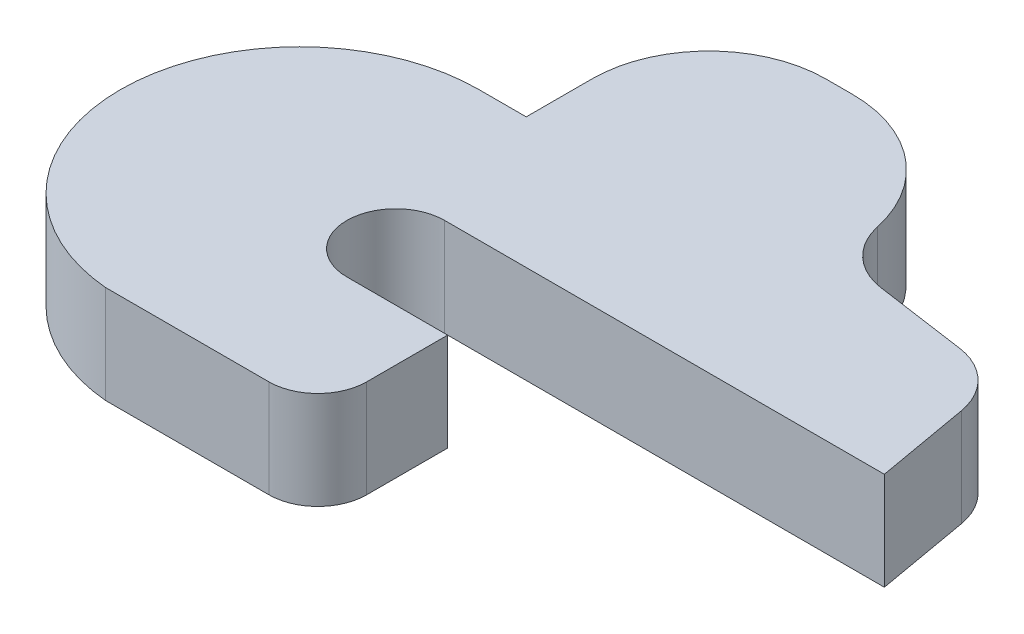
ISO-10303-21;
HEADER;
FILE_DESCRIPTION(('STEP AP214'),'2;1');
FILE_NAME('part.step','',(''),(''),'','','');
FILE_SCHEMA(('AUTOMOTIVE_DESIGN { 1 0 10303 214 1 1 1 1 }'));
ENDSEC;
DATA;
#1=APPLICATION_CONTEXT('core data for automotive mechanical design processes');
#2=APPLICATION_PROTOCOL_DEFINITION('international standard','automotive_design',2000,#1);
#3=PRODUCT_CONTEXT('',#1,'mechanical');
#4=PRODUCT('Part','Part','',(#3));
#5=PRODUCT_RELATED_PRODUCT_CATEGORY('part','',(#4));
#6=PRODUCT_DEFINITION_FORMATION('','',#4);
#7=PRODUCT_DEFINITION_CONTEXT('part definition',#1,'design');
#8=PRODUCT_DEFINITION('design','',#6,#7);
#9=PRODUCT_DEFINITION_SHAPE('','',#8);
#10=(LENGTH_UNIT() NAMED_UNIT(*) SI_UNIT(.MILLI.,.METRE.));
#11=(NAMED_UNIT(*) PLANE_ANGLE_UNIT() SI_UNIT($,.RADIAN.));
#12=(NAMED_UNIT(*) SI_UNIT($,.STERADIAN.) SOLID_ANGLE_UNIT());
#13=UNCERTAINTY_MEASURE_WITH_UNIT(LENGTH_MEASURE(1.E-05),#10,'distance_accuracy_value','');
#14=(GEOMETRIC_REPRESENTATION_CONTEXT(3) GLOBAL_UNCERTAINTY_ASSIGNED_CONTEXT((#13)) GLOBAL_UNIT_ASSIGNED_CONTEXT((#10,
#11,#12)) REPRESENTATION_CONTEXT('',''));
#15=CARTESIAN_POINT('',(0.,0.,0.));
#16=DIRECTION('',(0.,0.,1.));
#17=DIRECTION('',(1.,0.,0.));
#18=AXIS2_PLACEMENT_3D('',#15,#16,#17);
#19=CARTESIAN_POINT('',(0.,3.,2.48));
#20=DIRECTION('',(-1.,0.,0.));
#21=DIRECTION('',(0.,0.,1.));
#22=AXIS2_PLACEMENT_3D('',#19,#20,#21);
#23=PLANE('',#22);
#24=DIRECTION('',(0.,0.,-1.));
#25=VECTOR('',#24,1.);
#26=CARTESIAN_POINT('',(0.,0.,2.48));
#27=LINE('',#26,#25);
#28=CARTESIAN_POINT('',(0.,0.,2.48));
#29=VERTEX_POINT('',#28);
#30=CARTESIAN_POINT('',(0.,0.,0.));
#31=VERTEX_POINT('',#30);
#32=EDGE_CURVE('E177',#29,#31,#27,.T.);
#33=ORIENTED_EDGE('',*,*,#32,.T.);
#34=DIRECTION('',(0.,-1.,0.));
#35=VECTOR('',#34,1.);
#36=CARTESIAN_POINT('',(0.,3.,0.));
#37=LINE('',#36,#35);
#38=CARTESIAN_POINT('',(0.,3.,0.));
#39=VERTEX_POINT('',#38);
#40=EDGE_CURVE('E11',#39,#31,#37,.T.);
#41=ORIENTED_EDGE('',*,*,#40,.F.);
#42=DIRECTION('',(0.,0.,-1.));
#43=VECTOR('',#42,1.);
#44=CARTESIAN_POINT('',(0.,3.,2.48));
#45=LINE('',#44,#43);
#46=CARTESIAN_POINT('',(0.,3.,2.48));
#47=VERTEX_POINT('',#46);
#48=EDGE_CURVE('E207',#47,#39,#45,.T.);
#49=ORIENTED_EDGE('',*,*,#48,.F.);
#50=DIRECTION('',(0.,-1.,0.));
#51=VECTOR('',#50,1.);
#52=CARTESIAN_POINT('',(0.,3.,2.48));
#53=LINE('',#52,#51);
#54=EDGE_CURVE('E173',#47,#29,#53,.T.);
#55=ORIENTED_EDGE('',*,*,#54,.T.);
#56=EDGE_LOOP('',(#33,#41,#49,#55));
#57=FACE_BOUND('',#56,.T.);
#58=ADVANCED_FACE('F33',(#57),#23,.F.);
#59=CARTESIAN_POINT('',(0.,3.,0.));
#60=DIRECTION('',(0.,0.,1.));
#61=DIRECTION('',(1.,0.,0.));
#62=AXIS2_PLACEMENT_3D('',#59,#60,#61);
#63=PLANE('',#62);
#64=DIRECTION('',(-1.,0.,0.));
#65=VECTOR('',#64,1.);
#66=CARTESIAN_POINT('',(0.,0.,0.));
#67=LINE('',#66,#65);
#68=CARTESIAN_POINT('',(-3.09,0.,0.));
#69=VERTEX_POINT('',#68);
#70=EDGE_CURVE('E180',#31,#69,#67,.T.);
#71=ORIENTED_EDGE('',*,*,#70,.T.);
#72=DIRECTION('',(0.,-1.,0.));
#73=VECTOR('',#72,1.);
#74=CARTESIAN_POINT('',(-3.09,3.,0.));
#75=LINE('',#74,#73);
#76=CARTESIAN_POINT('',(-3.09,3.,0.));
#77=VERTEX_POINT('',#76);
#78=EDGE_CURVE('E41',#77,#69,#75,.T.);
#79=ORIENTED_EDGE('',*,*,#78,.F.);
#80=DIRECTION('',(-1.,0.,0.));
#81=VECTOR('',#80,1.);
#82=CARTESIAN_POINT('',(0.,3.,0.));
#83=LINE('',#82,#81);
#84=EDGE_CURVE('E116',#39,#77,#83,.T.);
#85=ORIENTED_EDGE('',*,*,#84,.F.);
#86=ORIENTED_EDGE('',*,*,#40,.T.);
#87=EDGE_LOOP('',(#71,#79,#85,#86));
#88=FACE_BOUND('',#87,.T.);
#89=ADVANCED_FACE('F305',(#88),#63,.F.);
#90=CARTESIAN_POINT('',(-3.09,3.,-1.5));
#91=DIRECTION('',(0.,-1.,0.));
#92=DIRECTION('',(0.,0.,-1.));
#93=AXIS2_PLACEMENT_3D('',#90,#91,#92);
#94=CYLINDRICAL_SURFACE('',#93,1.5);
#95=CARTESIAN_POINT('',(-3.09,0.,-1.5));
#96=DIRECTION('',(0.,-1.,0.));
#97=DIRECTION('',(0.,0.,-1.));
#98=AXIS2_PLACEMENT_3D('',#95,#96,#97);
#99=CIRCLE('',#98,1.5);
#100=CARTESIAN_POINT('',(-3.09,0.,-3.));
#101=VERTEX_POINT('',#100);
#102=EDGE_CURVE('E182',#69,#101,#99,.T.);
#103=ORIENTED_EDGE('',*,*,#102,.T.);
#104=DIRECTION('',(0.,-1.,0.));
#105=VECTOR('',#104,1.);
#106=CARTESIAN_POINT('',(-3.09,3.,-3.));
#107=LINE('',#106,#105);
#108=CARTESIAN_POINT('',(-3.09,3.,-3.));
#109=VERTEX_POINT('',#108);
#110=EDGE_CURVE('E238',#109,#101,#107,.T.);
#111=ORIENTED_EDGE('',*,*,#110,.F.);
#112=CARTESIAN_POINT('',(-3.09,3.,-1.5));
#113=DIRECTION('',(0.,-1.,0.));
#114=DIRECTION('',(0.,0.,-1.));
#115=AXIS2_PLACEMENT_3D('',#112,#113,#114);
#116=CIRCLE('',#115,1.5);
#117=EDGE_CURVE('E246',#77,#109,#116,.T.);
#118=ORIENTED_EDGE('',*,*,#117,.F.);
#119=ORIENTED_EDGE('',*,*,#78,.T.);
#120=EDGE_LOOP('',(#103,#111,#118,#119));
#121=FACE_BOUND('',#120,.T.);
#122=ADVANCED_FACE('F244',(#121),#94,.F.);
#123=CARTESIAN_POINT('',(-3.09,3.,-3.));
#124=DIRECTION('',(0.,0.,-1.));
#125=DIRECTION('',(-1.,0.,0.));
#126=AXIS2_PLACEMENT_3D('',#123,#124,#125);
#127=PLANE('',#126);
#128=DIRECTION('',(1.,0.,0.));
#129=VECTOR('',#128,1.);
#130=CARTESIAN_POINT('',(-3.09,0.,-3.));
#131=LINE('',#130,#129);
#132=CARTESIAN_POINT('',(10.39,0.,-3.));
#133=VERTEX_POINT('',#132);
#134=EDGE_CURVE('E184',#101,#133,#131,.T.);
#135=ORIENTED_EDGE('',*,*,#134,.T.);
#136=DIRECTION('',(0.,-1.,0.));
#137=VECTOR('',#136,1.);
#138=CARTESIAN_POINT('',(10.39,3.,-3.));
#139=LINE('',#138,#137);
#140=CARTESIAN_POINT('',(10.39,3.,-3.));
#141=VERTEX_POINT('',#140);
#142=EDGE_CURVE('E235',#141,#133,#139,.T.);
#143=ORIENTED_EDGE('',*,*,#142,.F.);
#144=DIRECTION('',(1.,0.,0.));
#145=VECTOR('',#144,1.);
#146=CARTESIAN_POINT('',(-3.09,3.,-3.));
#147=LINE('',#146,#145);
#148=EDGE_CURVE('E264',#109,#141,#147,.T.);
#149=ORIENTED_EDGE('',*,*,#148,.F.);
#150=ORIENTED_EDGE('',*,*,#110,.T.);
#151=EDGE_LOOP('',(#135,#143,#149,#150));
#152=FACE_BOUND('',#151,.T.);
#153=ADVANCED_FACE('F255',(#152),#127,.F.);
#154=CARTESIAN_POINT('',(10.39,3.,-3.));
#155=DIRECTION('',(-0.984807753012207,0.,0.173648177666935));
#156=DIRECTION('',(0.173648177666935,0.,0.984807753012207));
#157=AXIS2_PLACEMENT_3D('',#154,#155,#156);
#158=PLANE('',#157);
#159=DIRECTION('',(-0.173648177666935,0.,-0.984807753012207));
#160=VECTOR('',#159,1.);
#161=CARTESIAN_POINT('',(10.39,0.,-3.));
#162=LINE('',#161,#160);
#163=CARTESIAN_POINT('',(9.88440749893081,0.,-5.86735755944867));
#164=VERTEX_POINT('',#163);
#165=EDGE_CURVE('E186',#133,#164,#162,.T.);
#166=ORIENTED_EDGE('',*,*,#165,.T.);
#167=DIRECTION('',(0.,-1.,0.));
#168=VECTOR('',#167,1.);
#169=CARTESIAN_POINT('',(9.88440749893081,3.,-5.86735755944867));
#170=LINE('',#169,#168);
#171=CARTESIAN_POINT('',(9.88440749893081,3.,-5.86735755944867));
#172=VERTEX_POINT('',#171);
#173=EDGE_CURVE('E232',#172,#164,#170,.T.);
#174=ORIENTED_EDGE('',*,*,#173,.F.);
#175=DIRECTION('',(-0.173648177666935,0.,-0.984807753012207));
#176=VECTOR('',#175,1.);
#177=CARTESIAN_POINT('',(10.39,3.,-3.));
#178=LINE('',#177,#176);
#179=EDGE_CURVE('E261',#141,#172,#178,.T.);
#180=ORIENTED_EDGE('',*,*,#179,.F.);
#181=ORIENTED_EDGE('',*,*,#142,.T.);
#182=EDGE_LOOP('',(#166,#174,#180,#181));
#183=FACE_BOUND('',#182,.T.);
#184=ADVANCED_FACE('F259',(#183),#158,.F.);
#185=CARTESIAN_POINT('',(7.9147919929064,3.,-5.5200612041148));
#186=DIRECTION('',(0.,-1.,0.));
#187=DIRECTION('',(0.,0.,-1.));
#188=AXIS2_PLACEMENT_3D('',#185,#186,#187);
#189=CYLINDRICAL_SURFACE('',#188,1.99999999999999);
#190=CARTESIAN_POINT('',(7.9147919929064,0.,-5.5200612041148));
#191=DIRECTION('',(0.,1.,0.));
#192=DIRECTION('',(0.,0.,1.));
#193=AXIS2_PLACEMENT_3D('',#190,#191,#192);
#194=CIRCLE('',#193,1.99999999999999);
#195=CARTESIAN_POINT('',(8.19735590523176,0.,-7.5));
#196=VERTEX_POINT('',#195);
#197=EDGE_CURVE('E188',#164,#196,#194,.T.);
#198=ORIENTED_EDGE('',*,*,#197,.T.);
#199=DIRECTION('',(0.,-1.,0.));
#200=VECTOR('',#199,1.);
#201=CARTESIAN_POINT('',(8.19735590523176,3.,-7.5));
#202=LINE('',#201,#200);
#203=CARTESIAN_POINT('',(8.19735590523176,3.,-7.5));
#204=VERTEX_POINT('',#203);
#205=EDGE_CURVE('E229',#204,#196,#202,.T.);
#206=ORIENTED_EDGE('',*,*,#205,.F.);
#207=CARTESIAN_POINT('',(7.9147919929064,3.,-5.5200612041148));
#208=DIRECTION('',(0.,1.,0.));
#209=DIRECTION('',(0.,0.,1.));
#210=AXIS2_PLACEMENT_3D('',#207,#208,#209);
#211=CIRCLE('',#210,1.99999999999999);
#212=EDGE_CURVE('E263',#172,#204,#211,.T.);
#213=ORIENTED_EDGE('',*,*,#212,.F.);
#214=ORIENTED_EDGE('',*,*,#173,.T.);
#215=EDGE_LOOP('',(#198,#206,#213,#214));
#216=FACE_BOUND('',#215,.T.);
#217=ADVANCED_FACE('F318',(#216),#189,.T.);
#218=CARTESIAN_POINT('',(5.39,3.,-7.90064746926547));
#219=DIRECTION('',(-0.141281956162671,0.,0.989969397942608));
#220=DIRECTION('',(0.989969397942608,0.,0.141281956162671));
#221=AXIS2_PLACEMENT_3D('',#218,#219,#220);
#222=PLANE('',#221);
#223=DIRECTION('',(-0.989969397942608,0.,-0.141281956162671));
#224=VECTOR('',#223,1.);
#225=CARTESIAN_POINT('',(5.39,0.,-7.90064746926547));
#226=LINE('',#225,#224);
#227=CARTESIAN_POINT('',(5.39,0.,-7.90064746926547));
#228=VERTEX_POINT('',#227);
#229=EDGE_CURVE('E190',#196,#228,#226,.T.);
#230=ORIENTED_EDGE('',*,*,#229,.T.);
#231=DIRECTION('',(0.,-1.,0.));
#232=VECTOR('',#231,1.);
#233=CARTESIAN_POINT('',(5.39,3.,-7.90064746926547));
#234=LINE('',#233,#232);
#235=CARTESIAN_POINT('',(5.39,3.,-7.90064746926547));
#236=VERTEX_POINT('',#235);
#237=EDGE_CURVE('E226',#236,#228,#234,.T.);
#238=ORIENTED_EDGE('',*,*,#237,.F.);
#239=DIRECTION('',(-0.989969397942608,0.,-0.141281956162671));
#240=VECTOR('',#239,1.);
#241=CARTESIAN_POINT('',(5.39,3.,-7.90064746926547));
#242=LINE('',#241,#240);
#243=EDGE_CURVE('E266',#204,#236,#242,.T.);
#244=ORIENTED_EDGE('',*,*,#243,.F.);
#245=ORIENTED_EDGE('',*,*,#205,.T.);
#246=EDGE_LOOP('',(#230,#238,#244,#245));
#247=FACE_BOUND('',#246,.T.);
#248=ADVANCED_FACE('F321',(#247),#222,.F.);
#249=CARTESIAN_POINT('',(5.67256391232537,3.,-9.8805862651507));
#250=DIRECTION('',(0.,-1.,0.));
#251=DIRECTION('',(0.,0.,-1.));
#252=AXIS2_PLACEMENT_3D('',#249,#250,#251);
#253=CYLINDRICAL_SURFACE('',#252,2.00000000000001);
#254=CARTESIAN_POINT('',(5.67256391232537,0.,-9.8805862651507));
#255=DIRECTION('',(0.,-1.,0.));
#256=DIRECTION('',(0.,0.,-1.));
#257=AXIS2_PLACEMENT_3D('',#254,#255,#256);
#258=CIRCLE('',#257,2.00000000000001);
#259=CARTESIAN_POINT('',(3.71864765068547,0.,-9.45372417676713));
#260=VERTEX_POINT('',#259);
#261=EDGE_CURVE('E192',#228,#260,#258,.T.);
#262=ORIENTED_EDGE('',*,*,#261,.T.);
#263=DIRECTION('',(0.,-1.,0.));
#264=VECTOR('',#263,1.);
#265=CARTESIAN_POINT('',(3.71864765068547,3.,-9.45372417676713));
#266=LINE('',#265,#264);
#267=CARTESIAN_POINT('',(3.71864765068547,3.,-9.45372417676713));
#268=VERTEX_POINT('',#267);
#269=EDGE_CURVE('E223',#268,#260,#266,.T.);
#270=ORIENTED_EDGE('',*,*,#269,.F.);
#271=CARTESIAN_POINT('',(5.67256391232537,3.,-9.8805862651507));
#272=DIRECTION('',(0.,-1.,0.));
#273=DIRECTION('',(0.,0.,-1.));
#274=AXIS2_PLACEMENT_3D('',#271,#272,#273);
#275=CIRCLE('',#274,2.00000000000001);
#276=EDGE_CURVE('E272',#236,#268,#275,.T.);
#277=ORIENTED_EDGE('',*,*,#276,.F.);
#278=ORIENTED_EDGE('',*,*,#237,.T.);
#279=EDGE_LOOP('',(#262,#270,#277,#278));
#280=FACE_BOUND('',#279,.T.);
#281=ADVANCED_FACE('F325',(#280),#253,.F.);
#282=CARTESIAN_POINT('',(-0.189184872594318,3.,-8.6));
#283=DIRECTION('',(0.,-1.,0.));
#284=DIRECTION('',(0.,0.,-1.));
#285=AXIS2_PLACEMENT_3D('',#282,#283,#284);
#286=CYLINDRICAL_SURFACE('',#285,4.);
#287=CARTESIAN_POINT('',(-0.189184872594318,0.,-8.6));
#288=DIRECTION('',(0.,1.,0.));
#289=DIRECTION('',(0.,0.,-1.));
#290=AXIS2_PLACEMENT_3D('',#287,#288,#289);
#291=CIRCLE('',#290,4.);
#292=CARTESIAN_POINT('',(-0.189184872594318,0.,-12.6));
#293=VERTEX_POINT('',#292);
#294=EDGE_CURVE('E194',#260,#293,#291,.T.);
#295=ORIENTED_EDGE('',*,*,#294,.T.);
#296=DIRECTION('',(0.,-1.,0.));
#297=VECTOR('',#296,1.);
#298=CARTESIAN_POINT('',(-0.189184872594318,3.,-12.6));
#299=LINE('',#298,#297);
#300=CARTESIAN_POINT('',(-0.189184872594318,3.,-12.6));
#301=VERTEX_POINT('',#300);
#302=EDGE_CURVE('E220',#301,#293,#299,.T.);
#303=ORIENTED_EDGE('',*,*,#302,.F.);
#304=CARTESIAN_POINT('',(-0.189184872594318,3.,-8.6));
#305=DIRECTION('',(0.,1.,0.));
#306=DIRECTION('',(0.,0.,-1.));
#307=AXIS2_PLACEMENT_3D('',#304,#305,#306);
#308=CIRCLE('',#307,4.);
#309=EDGE_CURVE('E274',#268,#301,#308,.T.);
#310=ORIENTED_EDGE('',*,*,#309,.F.);
#311=ORIENTED_EDGE('',*,*,#269,.T.);
#312=EDGE_LOOP('',(#295,#303,#310,#311));
#313=FACE_BOUND('',#312,.T.);
#314=ADVANCED_FACE('F329',(#313),#286,.T.);
#315=CARTESIAN_POINT('',(-0.189184872594319,3.,-12.6));
#316=DIRECTION('',(0.,0.,1.));
#317=DIRECTION('',(1.,0.,0.));
#318=AXIS2_PLACEMENT_3D('',#315,#316,#317);
#319=PLANE('',#318);
#320=DIRECTION('',(-1.,0.,0.));
#321=VECTOR('',#320,1.);
#322=CARTESIAN_POINT('',(-0.189184872594319,0.,-12.6));
#323=LINE('',#322,#321);
#324=CARTESIAN_POINT('',(-1.,0.,-12.6));
#325=VERTEX_POINT('',#324);
#326=EDGE_CURVE('E196',#293,#325,#323,.T.);
#327=ORIENTED_EDGE('',*,*,#326,.T.);
#328=DIRECTION('',(0.,-1.,0.));
#329=VECTOR('',#328,1.);
#330=CARTESIAN_POINT('',(-1.,3.,-12.6));
#331=LINE('',#330,#329);
#332=CARTESIAN_POINT('',(-1.,3.,-12.6));
#333=VERTEX_POINT('',#332);
#334=EDGE_CURVE('E217',#333,#325,#331,.T.);
#335=ORIENTED_EDGE('',*,*,#334,.F.);
#336=DIRECTION('',(-1.,0.,0.));
#337=VECTOR('',#336,1.);
#338=CARTESIAN_POINT('',(-0.189184872594319,3.,-12.6));
#339=LINE('',#338,#337);
#340=EDGE_CURVE('E276',#301,#333,#339,.T.);
#341=ORIENTED_EDGE('',*,*,#340,.F.);
#342=ORIENTED_EDGE('',*,*,#302,.T.);
#343=EDGE_LOOP('',(#327,#335,#341,#342));
#344=FACE_BOUND('',#343,.T.);
#345=ADVANCED_FACE('F333',(#344),#319,.F.);
#346=CARTESIAN_POINT('',(-1.,3.,-9.01));
#347=DIRECTION('',(0.,-1.,0.));
#348=DIRECTION('',(0.,0.,-1.));
#349=AXIS2_PLACEMENT_3D('',#346,#347,#348);
#350=CYLINDRICAL_SURFACE('',#349,3.59);
#351=CARTESIAN_POINT('',(-1.,0.,-9.01));
#352=DIRECTION('',(0.,1.,0.));
#353=DIRECTION('',(0.,0.,1.));
#354=AXIS2_PLACEMENT_3D('',#351,#352,#353);
#355=CIRCLE('',#354,3.59);
#356=CARTESIAN_POINT('',(-4.59,0.,-9.01));
#357=VERTEX_POINT('',#356);
#358=EDGE_CURVE('E198',#325,#357,#355,.T.);
#359=ORIENTED_EDGE('',*,*,#358,.T.);
#360=DIRECTION('',(0.,-1.,0.));
#361=VECTOR('',#360,1.);
#362=CARTESIAN_POINT('',(-4.59,3.,-9.01));
#363=LINE('',#362,#361);
#364=CARTESIAN_POINT('',(-4.59,3.,-9.01));
#365=VERTEX_POINT('',#364);
#366=EDGE_CURVE('E214',#365,#357,#363,.T.);
#367=ORIENTED_EDGE('',*,*,#366,.F.);
#368=CARTESIAN_POINT('',(-1.,3.,-9.01));
#369=DIRECTION('',(0.,1.,0.));
#370=DIRECTION('',(0.,0.,1.));
#371=AXIS2_PLACEMENT_3D('',#368,#369,#370);
#372=CIRCLE('',#371,3.59);
#373=EDGE_CURVE('E278',#333,#365,#372,.T.);
#374=ORIENTED_EDGE('',*,*,#373,.F.);
#375=ORIENTED_EDGE('',*,*,#334,.T.);
#376=EDGE_LOOP('',(#359,#367,#374,#375));
#377=FACE_BOUND('',#376,.T.);
#378=ADVANCED_FACE('F337',(#377),#350,.T.);
#379=CARTESIAN_POINT('',(-4.59,3.,-9.01));
#380=DIRECTION('',(1.,0.,0.));
#381=DIRECTION('',(0.,0.,-1.));
#382=AXIS2_PLACEMENT_3D('',#379,#380,#381);
#383=PLANE('',#382);
#384=DIRECTION('',(0.,0.,1.));
#385=VECTOR('',#384,1.);
#386=CARTESIAN_POINT('',(-4.59,0.,-9.01));
#387=LINE('',#386,#385);
#388=CARTESIAN_POINT('',(-4.59,0.,-7.));
#389=VERTEX_POINT('',#388);
#390=EDGE_CURVE('E200',#357,#389,#387,.T.);
#391=ORIENTED_EDGE('',*,*,#390,.T.);
#392=DIRECTION('',(0.,-1.,0.));
#393=VECTOR('',#392,1.);
#394=CARTESIAN_POINT('',(-4.59,3.,-7.));
#395=LINE('',#394,#393);
#396=CARTESIAN_POINT('',(-4.59,3.,-7.));
#397=VERTEX_POINT('',#396);
#398=EDGE_CURVE('E211',#397,#389,#395,.T.);
#399=ORIENTED_EDGE('',*,*,#398,.F.);
#400=DIRECTION('',(0.,0.,1.));
#401=VECTOR('',#400,1.);
#402=CARTESIAN_POINT('',(-4.59,3.,-9.01));
#403=LINE('',#402,#401);
#404=EDGE_CURVE('E280',#365,#397,#403,.T.);
#405=ORIENTED_EDGE('',*,*,#404,.F.);
#406=ORIENTED_EDGE('',*,*,#366,.T.);
#407=EDGE_LOOP('',(#391,#399,#405,#406));
#408=FACE_BOUND('',#407,.T.);
#409=ADVANCED_FACE('F286',(#408),#383,.F.);
#410=CARTESIAN_POINT('',(-4.59,3.,-7.));
#411=DIRECTION('',(0.,0.,1.));
#412=DIRECTION('',(1.,0.,0.));
#413=AXIS2_PLACEMENT_3D('',#410,#411,#412);
#414=PLANE('',#413);
#415=DIRECTION('',(-1.,0.,0.));
#416=VECTOR('',#415,1.);
#417=CARTESIAN_POINT('',(-4.59,0.,-7.));
#418=LINE('',#417,#416);
#419=CARTESIAN_POINT('',(-6.03500227479574,0.,-7.));
#420=VERTEX_POINT('',#419);
#421=EDGE_CURVE('E202',#389,#420,#418,.T.);
#422=ORIENTED_EDGE('',*,*,#421,.T.);
#423=DIRECTION('',(0.,-1.,0.));
#424=VECTOR('',#423,1.);
#425=CARTESIAN_POINT('',(-6.03500227479574,3.,-7.));
#426=LINE('',#425,#424);
#427=CARTESIAN_POINT('',(-6.03500227479574,3.,-7.));
#428=VERTEX_POINT('',#427);
#429=EDGE_CURVE('E168',#428,#420,#426,.T.);
#430=ORIENTED_EDGE('',*,*,#429,.F.);
#431=DIRECTION('',(-1.,0.,0.));
#432=VECTOR('',#431,1.);
#433=CARTESIAN_POINT('',(-4.59,3.,-7.));
#434=LINE('',#433,#432);
#435=EDGE_CURVE('E159',#397,#428,#434,.T.);
#436=ORIENTED_EDGE('',*,*,#435,.F.);
#437=ORIENTED_EDGE('',*,*,#398,.T.);
#438=EDGE_LOOP('',(#422,#430,#436,#437));
#439=FACE_BOUND('',#438,.T.);
#440=ADVANCED_FACE('F290',(#439),#414,.F.);
#441=CARTESIAN_POINT('',(-6.03500227479574,3.,-1.5));
#442=DIRECTION('',(0.,-1.,0.));
#443=DIRECTION('',(0.,0.,-1.));
#444=AXIS2_PLACEMENT_3D('',#441,#442,#443);
#445=CYLINDRICAL_SURFACE('',#444,5.5);
#446=CARTESIAN_POINT('',(-6.03500227479574,0.,-1.5));
#447=DIRECTION('',(0.,1.,0.));
#448=DIRECTION('',(0.,0.,1.));
#449=AXIS2_PLACEMENT_3D('',#446,#447,#448);
#450=CIRCLE('',#449,5.5);
#451=CARTESIAN_POINT('',(-6.50361725535017,0.,3.98));
#452=VERTEX_POINT('',#451);
#453=EDGE_CURVE('E167',#420,#452,#450,.T.);
#454=ORIENTED_EDGE('',*,*,#453,.T.);
#455=DIRECTION('',(0.,-1.,0.));
#456=VECTOR('',#455,1.);
#457=CARTESIAN_POINT('',(-6.50361725535017,3.,3.98));
#458=LINE('',#457,#456);
#459=CARTESIAN_POINT('',(-6.50361725535017,3.,3.98));
#460=VERTEX_POINT('',#459);
#461=EDGE_CURVE('E164',#460,#452,#458,.T.);
#462=ORIENTED_EDGE('',*,*,#461,.F.);
#463=CARTESIAN_POINT('',(-6.03500227479574,3.,-1.5));
#464=DIRECTION('',(0.,1.,0.));
#465=DIRECTION('',(0.,0.,1.));
#466=AXIS2_PLACEMENT_3D('',#463,#464,#465);
#467=CIRCLE('',#466,5.5);
#468=EDGE_CURVE('E153',#428,#460,#467,.T.);
#469=ORIENTED_EDGE('',*,*,#468,.F.);
#470=ORIENTED_EDGE('',*,*,#429,.T.);
#471=EDGE_LOOP('',(#454,#462,#469,#470));
#472=FACE_BOUND('',#471,.T.);
#473=ADVANCED_FACE('F165',(#472),#445,.T.);
#474=CARTESIAN_POINT('',(-6.50361725535017,3.,3.98));
#475=DIRECTION('',(0.,0.,-1.));
#476=DIRECTION('',(-1.,0.,0.));
#477=AXIS2_PLACEMENT_3D('',#474,#475,#476);
#478=PLANE('',#477);
#479=DIRECTION('',(1.,0.,0.));
#480=VECTOR('',#479,1.);
#481=CARTESIAN_POINT('',(-6.50361725535017,0.,3.98));
#482=LINE('',#481,#480);
#483=CARTESIAN_POINT('',(-1.5,0.,3.98));
#484=VERTEX_POINT('',#483);
#485=EDGE_CURVE('E102',#452,#484,#482,.T.);
#486=ORIENTED_EDGE('',*,*,#485,.T.);
#487=DIRECTION('',(0.,-1.,0.));
#488=VECTOR('',#487,1.);
#489=CARTESIAN_POINT('',(-1.5,3.,3.98));
#490=LINE('',#489,#488);
#491=CARTESIAN_POINT('',(-1.5,3.,3.98));
#492=VERTEX_POINT('',#491);
#493=EDGE_CURVE('E169',#492,#484,#490,.T.);
#494=ORIENTED_EDGE('',*,*,#493,.F.);
#495=DIRECTION('',(1.,0.,0.));
#496=VECTOR('',#495,1.);
#497=CARTESIAN_POINT('',(-6.50361725535017,3.,3.98));
#498=LINE('',#497,#496);
#499=EDGE_CURVE('E157',#460,#492,#498,.T.);
#500=ORIENTED_EDGE('',*,*,#499,.F.);
#501=ORIENTED_EDGE('',*,*,#461,.T.);
#502=EDGE_LOOP('',(#486,#494,#500,#501));
#503=FACE_BOUND('',#502,.T.);
#504=ADVANCED_FACE('F171',(#503),#478,.F.);
#505=CARTESIAN_POINT('',(-1.5,3.,2.48));
#506=DIRECTION('',(0.,-1.,0.));
#507=DIRECTION('',(0.,0.,-1.));
#508=AXIS2_PLACEMENT_3D('',#505,#506,#507);
#509=CYLINDRICAL_SURFACE('',#508,1.5);
#510=CARTESIAN_POINT('',(-1.5,0.,2.48));
#511=DIRECTION('',(0.,1.,0.));
#512=DIRECTION('',(0.,0.,1.));
#513=AXIS2_PLACEMENT_3D('',#510,#511,#512);
#514=CIRCLE('',#513,1.5);
#515=EDGE_CURVE('E108',#484,#29,#514,.T.);
#516=ORIENTED_EDGE('',*,*,#515,.T.);
#517=ORIENTED_EDGE('',*,*,#54,.F.);
#518=CARTESIAN_POINT('',(-1.5,3.,2.48));
#519=DIRECTION('',(0.,1.,0.));
#520=DIRECTION('',(0.,0.,1.));
#521=AXIS2_PLACEMENT_3D('',#518,#519,#520);
#522=CIRCLE('',#521,1.5);
#523=EDGE_CURVE('E49',#492,#47,#522,.T.);
#524=ORIENTED_EDGE('',*,*,#523,.F.);
#525=ORIENTED_EDGE('',*,*,#493,.T.);
#526=EDGE_LOOP('',(#516,#517,#524,#525));
#527=FACE_BOUND('',#526,.T.);
#528=ADVANCED_FACE('F294',(#527),#509,.T.);
#529=CARTESIAN_POINT('',(-3.09,3.,-1.5));
#530=DIRECTION('',(0.,-1.,0.));
#531=DIRECTION('',(0.,0.,-1.));
#532=AXIS2_PLACEMENT_3D('',#529,#530,#531);
#533=PLANE('',#532);
#534=ORIENTED_EDGE('',*,*,#48,.T.);
#535=ORIENTED_EDGE('',*,*,#84,.T.);
#536=ORIENTED_EDGE('',*,*,#117,.T.);
#537=ORIENTED_EDGE('',*,*,#148,.T.);
#538=ORIENTED_EDGE('',*,*,#179,.T.);
#539=ORIENTED_EDGE('',*,*,#212,.T.);
#540=ORIENTED_EDGE('',*,*,#243,.T.);
#541=ORIENTED_EDGE('',*,*,#276,.T.);
#542=ORIENTED_EDGE('',*,*,#309,.T.);
#543=ORIENTED_EDGE('',*,*,#340,.T.);
#544=ORIENTED_EDGE('',*,*,#373,.T.);
#545=ORIENTED_EDGE('',*,*,#404,.T.);
#546=ORIENTED_EDGE('',*,*,#435,.T.);
#547=ORIENTED_EDGE('',*,*,#468,.T.);
#548=ORIENTED_EDGE('',*,*,#499,.T.);
#549=ORIENTED_EDGE('',*,*,#523,.T.);
#550=EDGE_LOOP('',(#534,#535,#536,#537,#538,#539,#540,#541,#542,#543,#544,#545,#546,#547,#548,#549));
#551=FACE_BOUND('',#550,.T.);
#552=ADVANCED_FACE('F155',(#551),#533,.F.);
#553=CARTESIAN_POINT('',(-3.09,0.,-1.5));
#554=DIRECTION('',(0.,-1.,0.));
#555=DIRECTION('',(0.,0.,-1.));
#556=AXIS2_PLACEMENT_3D('',#553,#554,#555);
#557=PLANE('',#556);
#558=ORIENTED_EDGE('',*,*,#32,.F.);
#559=ORIENTED_EDGE('',*,*,#515,.F.);
#560=ORIENTED_EDGE('',*,*,#485,.F.);
#561=ORIENTED_EDGE('',*,*,#453,.F.);
#562=ORIENTED_EDGE('',*,*,#421,.F.);
#563=ORIENTED_EDGE('',*,*,#390,.F.);
#564=ORIENTED_EDGE('',*,*,#358,.F.);
#565=ORIENTED_EDGE('',*,*,#326,.F.);
#566=ORIENTED_EDGE('',*,*,#294,.F.);
#567=ORIENTED_EDGE('',*,*,#261,.F.);
#568=ORIENTED_EDGE('',*,*,#229,.F.);
#569=ORIENTED_EDGE('',*,*,#197,.F.);
#570=ORIENTED_EDGE('',*,*,#165,.F.);
#571=ORIENTED_EDGE('',*,*,#134,.F.);
#572=ORIENTED_EDGE('',*,*,#102,.F.);
#573=ORIENTED_EDGE('',*,*,#70,.F.);
#574=EDGE_LOOP('',(#558,#559,#560,#561,#562,#563,#564,#565,#566,#567,#568,#569,#570,#571,#572,#573));
#575=FACE_BOUND('',#574,.T.);
#576=ADVANCED_FACE('F250',(#575),#557,.T.);
#577=CLOSED_SHELL('',(#58,#89,#122,#153,#184,#217,#248,#281,#314,#345,#378,#409,#440,#473,#504,
#528,#552,#576));
#578=MANIFOLD_SOLID_BREP('B2',#577);
#579=ADVANCED_BREP_SHAPE_REPRESENTATION('',(#18,#578),#14);
#580=SHAPE_DEFINITION_REPRESENTATION(#9,#579);
ENDSEC;
END-ISO-10303-21;
